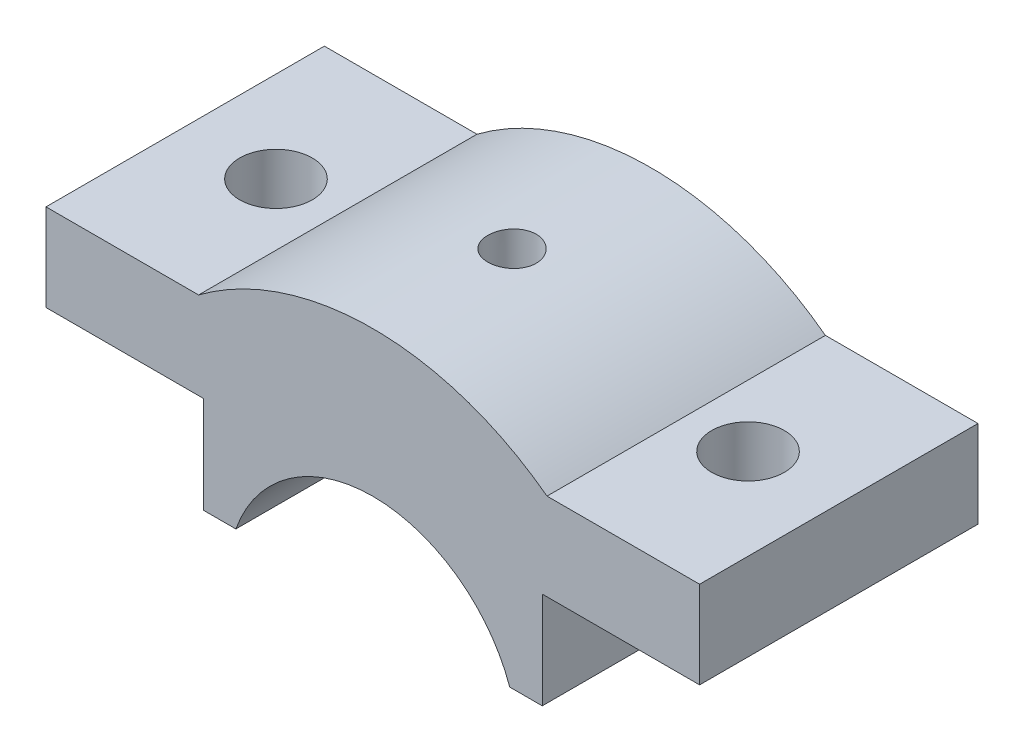
ISO-10303-21;
HEADER;
FILE_DESCRIPTION(('STEP AP214'),'2;1');
FILE_NAME('part.step','',(''),(''),'','','');
FILE_SCHEMA(('AUTOMOTIVE_DESIGN { 1 0 10303 214 1 1 1 1 }'));
ENDSEC;
DATA;
#1=APPLICATION_CONTEXT('core data for automotive mechanical design processes');
#2=APPLICATION_PROTOCOL_DEFINITION('international standard','automotive_design',2000,#1);
#3=PRODUCT_CONTEXT('',#1,'mechanical');
#4=PRODUCT('Part','Part','',(#3));
#5=PRODUCT_RELATED_PRODUCT_CATEGORY('part','',(#4));
#6=PRODUCT_DEFINITION_FORMATION('','',#4);
#7=PRODUCT_DEFINITION_CONTEXT('part definition',#1,'design');
#8=PRODUCT_DEFINITION('design','',#6,#7);
#9=PRODUCT_DEFINITION_SHAPE('','',#8);
#10=(LENGTH_UNIT() NAMED_UNIT(*) SI_UNIT(.MILLI.,.METRE.));
#11=(NAMED_UNIT(*) PLANE_ANGLE_UNIT() SI_UNIT($,.RADIAN.));
#12=(NAMED_UNIT(*) SI_UNIT($,.STERADIAN.) SOLID_ANGLE_UNIT());
#13=UNCERTAINTY_MEASURE_WITH_UNIT(LENGTH_MEASURE(1.E-05),#10,'distance_accuracy_value','');
#14=(GEOMETRIC_REPRESENTATION_CONTEXT(3) GLOBAL_UNCERTAINTY_ASSIGNED_CONTEXT((#13)) GLOBAL_UNIT_ASSIGNED_CONTEXT((#10,
#11,#12)) REPRESENTATION_CONTEXT('',''));
#15=CARTESIAN_POINT('',(0.,0.,0.));
#16=DIRECTION('',(0.,0.,1.));
#17=DIRECTION('',(1.,0.,0.));
#18=AXIS2_PLACEMENT_3D('',#15,#16,#17);
#19=CARTESIAN_POINT('',(0.,0.,23.));
#20=DIRECTION('',(0.,0.,-1.));
#21=DIRECTION('',(-1.,0.,0.));
#22=AXIS2_PLACEMENT_3D('',#19,#20,#21);
#23=CYLINDRICAL_SURFACE('',#22,48.);
#24=CARTESIAN_POINT('',(0.,0.,-23.));
#25=DIRECTION('',(0.,0.,1.));
#26=DIRECTION('',(1.,0.,0.));
#27=AXIS2_PLACEMENT_3D('',#24,#25,#26);
#28=CIRCLE('',#27,48.);
#29=CARTESIAN_POINT('',(28.7858838877286,38.4105830312716,-23.));
#30=VERTEX_POINT('',#29);
#31=CARTESIAN_POINT('',(-28.7858838877286,38.4105830312716,-23.));
#32=VERTEX_POINT('',#31);
#33=EDGE_CURVE('E196',#30,#32,#28,.T.);
#34=ORIENTED_EDGE('',*,*,#33,.T.);
#35=DIRECTION('',(0.,0.,-1.));
#36=VECTOR('',#35,1.);
#37=CARTESIAN_POINT('',(-28.7858838877286,38.4105830312716,23.));
#38=LINE('',#37,#36);
#39=CARTESIAN_POINT('',(-28.7858838877286,38.4105830312716,23.));
#40=VERTEX_POINT('',#39);
#41=EDGE_CURVE('E222',#40,#32,#38,.T.);
#42=ORIENTED_EDGE('',*,*,#41,.F.);
#43=CARTESIAN_POINT('',(0.,0.,23.));
#44=DIRECTION('',(0.,0.,1.));
#45=DIRECTION('',(1.,0.,0.));
#46=AXIS2_PLACEMENT_3D('',#43,#44,#45);
#47=CIRCLE('',#46,48.);
#48=CARTESIAN_POINT('',(28.7858838877286,38.4105830312716,23.));
#49=VERTEX_POINT('',#48);
#50=EDGE_CURVE('E371',#49,#40,#47,.T.);
#51=ORIENTED_EDGE('',*,*,#50,.F.);
#52=DIRECTION('',(0.,0.,-1.));
#53=VECTOR('',#52,1.);
#54=CARTESIAN_POINT('',(28.7858838877286,38.4105830312716,23.));
#55=LINE('',#54,#53);
#56=EDGE_CURVE('E226',#49,#30,#55,.T.);
#57=ORIENTED_EDGE('',*,*,#56,.T.);
#58=EDGE_LOOP('',(#34,#42,#51,#57));
#59=FACE_BOUND('',#58,.T.);
#60=CARTESIAN_POINT('',(0.,48.,-4.));
#61=CARTESIAN_POINT('',(-1.05752799732265,48.,-4.));
#62=CARTESIAN_POINT('',(-2.09108774168189,47.9601222706748,-3.5659117236837));
#63=CARTESIAN_POINT('',(-3.56632336716946,47.8730332630205,-2.09038561162722));
#64=CARTESIAN_POINT('',(-3.99943376542558,47.8330903233125,-1.04611595564905));
#65=CARTESIAN_POINT('',(-4.00056506023606,47.8329957197018,1.04178128007185));
#66=CARTESIAN_POINT('',(-3.57621927763035,47.8724331418488,2.07994955956065));
#67=CARTESIAN_POINT('',(-2.08322792062975,47.9606021717116,3.57431055208135));
#68=CARTESIAN_POINT('',(-1.04582107278193,47.9999683666595,3.9996203998891));
#69=CARTESIAN_POINT('',(1.04291530655166,48.000031589364,4.00037907239353));
#70=CARTESIAN_POINT('',(2.08744657475978,47.9602906118977,3.56798183397225));
#71=CARTESIAN_POINT('',(3.56394710745221,47.873219964772,2.09432771679011));
#72=CARTESIAN_POINT('',(3.99896851203287,47.8331292297215,1.06031077841387));
#73=CARTESIAN_POINT('',(4.00102768852446,47.832957032815,-1.05251391568548));
#74=CARTESIAN_POINT('',(3.56801605424093,47.8729030471747,-2.08766850917427));
#75=CARTESIAN_POINT('',(2.09331291409821,47.960021119378,-3.56470747904911));
#76=CARTESIAN_POINT('',(1.05752799732265,48.,-4.));
#77=CARTESIAN_POINT('',(0.,48.,-4.));
#78=B_SPLINE_CURVE_WITH_KNOTS('',3,(#60,#61,#62,#63,#64,#65,#66,#67,#68,#69,#70,#71,#72,#73,#74,
#75,#76,#77),.UNSPECIFIED.,.T.,.F.,(4,2,2,2,2,2,2,2,4),(0.,0.125,0.25,0.375,0.5,0.625,0.75,
0.875,1.),.UNSPECIFIED.);
#79=CARTESIAN_POINT('',(0.,48.,-4.));
#80=VERTEX_POINT('',#79);
#81=EDGE_CURVE('E252',#80,#80,#78,.T.);
#82=ORIENTED_EDGE('',*,*,#81,.F.);
#83=EDGE_LOOP('',(#82));
#84=FACE_BOUND('',#83,.T.);
#85=ADVANCED_FACE('F45',(#59,#84),#23,.T.);
#86=CARTESIAN_POINT('',(0.,0.,23.));
#87=DIRECTION('',(0.,0.,-1.));
#88=DIRECTION('',(-1.,0.,0.));
#89=AXIS2_PLACEMENT_3D('',#86,#87,#88);
#90=CYLINDRICAL_SURFACE('',#89,24.);
#91=CARTESIAN_POINT('',(0.,0.,-23.));
#92=DIRECTION('',(0.,0.,-1.));
#93=DIRECTION('',(1.,0.,0.));
#94=AXIS2_PLACEMENT_3D('',#91,#92,#93);
#95=CIRCLE('',#94,24.);
#96=CARTESIAN_POINT('',(-22.6274169979695,8.,-23.));
#97=VERTEX_POINT('',#96);
#98=CARTESIAN_POINT('',(22.6274169979695,7.99999999999999,-23.));
#99=VERTEX_POINT('',#98);
#100=EDGE_CURVE('E176',#97,#99,#95,.T.);
#101=ORIENTED_EDGE('',*,*,#100,.T.);
#102=DIRECTION('',(0.,0.,-1.));
#103=VECTOR('',#102,1.);
#104=CARTESIAN_POINT('',(22.6274169979695,7.99999999999999,23.));
#105=LINE('',#104,#103);
#106=CARTESIAN_POINT('',(22.6274169979695,7.99999999999999,23.));
#107=VERTEX_POINT('',#106);
#108=EDGE_CURVE('E11',#107,#99,#105,.T.);
#109=ORIENTED_EDGE('',*,*,#108,.F.);
#110=CARTESIAN_POINT('',(0.,0.,23.));
#111=DIRECTION('',(0.,0.,-1.));
#112=DIRECTION('',(1.,0.,0.));
#113=AXIS2_PLACEMENT_3D('',#110,#111,#112);
#114=CIRCLE('',#113,24.);
#115=CARTESIAN_POINT('',(-22.6274169979695,8.,23.));
#116=VERTEX_POINT('',#115);
#117=EDGE_CURVE('E211',#116,#107,#114,.T.);
#118=ORIENTED_EDGE('',*,*,#117,.F.);
#119=DIRECTION('',(0.,0.,-1.));
#120=VECTOR('',#119,1.);
#121=CARTESIAN_POINT('',(-22.6274169979695,8.,23.));
#122=LINE('',#121,#120);
#123=EDGE_CURVE('E172',#116,#97,#122,.T.);
#124=ORIENTED_EDGE('',*,*,#123,.T.);
#125=EDGE_LOOP('',(#101,#109,#118,#124));
#126=FACE_BOUND('',#125,.T.);
#127=ADVANCED_FACE('F47',(#126),#90,.F.);
#128=CARTESIAN_POINT('',(22.6274169979695,7.99999999999999,23.));
#129=DIRECTION('',(0.,1.,0.));
#130=DIRECTION('',(-1.,0.,0.));
#131=AXIS2_PLACEMENT_3D('',#128,#129,#130);
#132=PLANE('',#131);
#133=DIRECTION('',(1.,0.,0.));
#134=VECTOR('',#133,1.);
#135=CARTESIAN_POINT('',(22.6274169979695,7.99999999999999,-23.));
#136=LINE('',#135,#134);
#137=CARTESIAN_POINT('',(28.,8.,-23.));
#138=VERTEX_POINT('',#137);
#139=EDGE_CURVE('E180',#99,#138,#136,.T.);
#140=ORIENTED_EDGE('',*,*,#139,.T.);
#141=DIRECTION('',(0.,0.,-1.));
#142=VECTOR('',#141,1.);
#143=CARTESIAN_POINT('',(28.,8.,23.));
#144=LINE('',#143,#142);
#145=CARTESIAN_POINT('',(28.,8.,23.));
#146=VERTEX_POINT('',#145);
#147=EDGE_CURVE('E58',#146,#138,#144,.T.);
#148=ORIENTED_EDGE('',*,*,#147,.F.);
#149=DIRECTION('',(1.,0.,0.));
#150=VECTOR('',#149,1.);
#151=CARTESIAN_POINT('',(22.6274169979695,7.99999999999999,23.));
#152=LINE('',#151,#150);
#153=EDGE_CURVE('E122',#107,#146,#152,.T.);
#154=ORIENTED_EDGE('',*,*,#153,.F.);
#155=ORIENTED_EDGE('',*,*,#108,.T.);
#156=EDGE_LOOP('',(#140,#148,#154,#155));
#157=FACE_BOUND('',#156,.T.);
#158=ADVANCED_FACE('F341',(#157),#132,.F.);
#159=CARTESIAN_POINT('',(28.,8.,23.));
#160=DIRECTION('',(-1.,0.,0.));
#161=DIRECTION('',(0.,0.,1.));
#162=AXIS2_PLACEMENT_3D('',#159,#160,#161);
#163=PLANE('',#162);
#164=DIRECTION('',(0.,1.,0.));
#165=VECTOR('',#164,1.);
#166=CARTESIAN_POINT('',(28.,8.,-23.));
#167=LINE('',#166,#165);
#168=CARTESIAN_POINT('',(28.,24.,-23.));
#169=VERTEX_POINT('',#168);
#170=EDGE_CURVE('E184',#138,#169,#167,.T.);
#171=ORIENTED_EDGE('',*,*,#170,.T.);
#172=DIRECTION('',(0.,0.,-1.));
#173=VECTOR('',#172,1.);
#174=CARTESIAN_POINT('',(28.,24.,23.));
#175=LINE('',#174,#173);
#176=CARTESIAN_POINT('',(28.,24.,23.));
#177=VERTEX_POINT('',#176);
#178=EDGE_CURVE('E238',#177,#169,#175,.T.);
#179=ORIENTED_EDGE('',*,*,#178,.F.);
#180=DIRECTION('',(0.,1.,0.));
#181=VECTOR('',#180,1.);
#182=CARTESIAN_POINT('',(28.,8.,23.));
#183=LINE('',#182,#181);
#184=EDGE_CURVE('E353',#146,#177,#183,.T.);
#185=ORIENTED_EDGE('',*,*,#184,.F.);
#186=ORIENTED_EDGE('',*,*,#147,.T.);
#187=EDGE_LOOP('',(#171,#179,#185,#186));
#188=FACE_BOUND('',#187,.T.);
#189=ADVANCED_FACE('F338',(#188),#163,.F.);
#190=CARTESIAN_POINT('',(28.,24.,23.));
#191=DIRECTION('',(0.,1.,0.));
#192=DIRECTION('',(-1.,0.,0.));
#193=AXIS2_PLACEMENT_3D('',#190,#191,#192);
#194=PLANE('',#193);
#195=CARTESIAN_POINT('',(39.,24.,0.));
#196=DIRECTION('',(0.,1.,0.));
#197=DIRECTION('',(-1.,0.,0.));
#198=AXIS2_PLACEMENT_3D('',#195,#196,#197);
#199=CIRCLE('',#198,5.99999999999999);
#200=CARTESIAN_POINT('',(33.,24.,0.));
#201=VERTEX_POINT('',#200);
#202=EDGE_CURVE('E181',#201,#201,#199,.T.);
#203=ORIENTED_EDGE('',*,*,#202,.T.);
#204=EDGE_LOOP('',(#203));
#205=FACE_BOUND('',#204,.T.);
#206=DIRECTION('',(1.,0.,0.));
#207=VECTOR('',#206,1.);
#208=CARTESIAN_POINT('',(28.,24.,-23.));
#209=LINE('',#208,#207);
#210=CARTESIAN_POINT('',(54.,24.,-23.));
#211=VERTEX_POINT('',#210);
#212=EDGE_CURVE('E187',#169,#211,#209,.T.);
#213=ORIENTED_EDGE('',*,*,#212,.T.);
#214=DIRECTION('',(0.,0.,-1.));
#215=VECTOR('',#214,1.);
#216=CARTESIAN_POINT('',(54.,24.,23.));
#217=LINE('',#216,#215);
#218=CARTESIAN_POINT('',(54.,24.,23.));
#219=VERTEX_POINT('',#218);
#220=EDGE_CURVE('E234',#219,#211,#217,.T.);
#221=ORIENTED_EDGE('',*,*,#220,.F.);
#222=DIRECTION('',(1.,0.,0.));
#223=VECTOR('',#222,1.);
#224=CARTESIAN_POINT('',(28.,24.,23.));
#225=LINE('',#224,#223);
#226=EDGE_CURVE('E366',#177,#219,#225,.T.);
#227=ORIENTED_EDGE('',*,*,#226,.F.);
#228=ORIENTED_EDGE('',*,*,#178,.T.);
#229=EDGE_LOOP('',(#213,#221,#227,#228));
#230=FACE_BOUND('',#229,.T.);
#231=ADVANCED_FACE('F334',(#205,#230),#194,.F.);
#232=CARTESIAN_POINT('',(54.,24.,23.));
#233=DIRECTION('',(-1.,0.,0.));
#234=DIRECTION('',(0.,-1.,0.));
#235=AXIS2_PLACEMENT_3D('',#232,#233,#234);
#236=PLANE('',#235);
#237=DIRECTION('',(0.,1.,0.));
#238=VECTOR('',#237,1.);
#239=CARTESIAN_POINT('',(54.,24.,-23.));
#240=LINE('',#239,#238);
#241=CARTESIAN_POINT('',(54.,38.4105830312716,-23.));
#242=VERTEX_POINT('',#241);
#243=EDGE_CURVE('E190',#211,#242,#240,.T.);
#244=ORIENTED_EDGE('',*,*,#243,.T.);
#245=DIRECTION('',(0.,0.,-1.));
#246=VECTOR('',#245,1.);
#247=CARTESIAN_POINT('',(54.,38.4105830312716,23.));
#248=LINE('',#247,#246);
#249=CARTESIAN_POINT('',(54.,38.4105830312716,23.));
#250=VERTEX_POINT('',#249);
#251=EDGE_CURVE('E230',#250,#242,#248,.T.);
#252=ORIENTED_EDGE('',*,*,#251,.F.);
#253=DIRECTION('',(0.,1.,0.));
#254=VECTOR('',#253,1.);
#255=CARTESIAN_POINT('',(54.,24.,23.));
#256=LINE('',#255,#254);
#257=EDGE_CURVE('E362',#219,#250,#256,.T.);
#258=ORIENTED_EDGE('',*,*,#257,.F.);
#259=ORIENTED_EDGE('',*,*,#220,.T.);
#260=EDGE_LOOP('',(#244,#252,#258,#259));
#261=FACE_BOUND('',#260,.T.);
#262=ADVANCED_FACE('F330',(#261),#236,.F.);
#263=CARTESIAN_POINT('',(54.,38.4105830312716,23.));
#264=DIRECTION('',(0.,-1.,0.));
#265=DIRECTION('',(0.,0.,-1.));
#266=AXIS2_PLACEMENT_3D('',#263,#264,#265);
#267=PLANE('',#266);
#268=CARTESIAN_POINT('',(39.,38.4105830312716,0.));
#269=DIRECTION('',(0.,1.,0.));
#270=DIRECTION('',(0.,0.,1.));
#271=AXIS2_PLACEMENT_3D('',#268,#269,#270);
#272=CIRCLE('',#271,5.99999999999999);
#273=CARTESIAN_POINT('',(39.,38.4105830312716,5.99999999999999));
#274=VERTEX_POINT('',#273);
#275=EDGE_CURVE('E256',#274,#274,#272,.T.);
#276=ORIENTED_EDGE('',*,*,#275,.F.);
#277=EDGE_LOOP('',(#276));
#278=FACE_BOUND('',#277,.T.);
#279=DIRECTION('',(-1.,0.,0.));
#280=VECTOR('',#279,1.);
#281=CARTESIAN_POINT('',(54.,38.4105830312716,-23.));
#282=LINE('',#281,#280);
#283=EDGE_CURVE('E193',#242,#30,#282,.T.);
#284=ORIENTED_EDGE('',*,*,#283,.T.);
#285=ORIENTED_EDGE('',*,*,#56,.F.);
#286=DIRECTION('',(-1.,0.,0.));
#287=VECTOR('',#286,1.);
#288=CARTESIAN_POINT('',(54.,38.4105830312716,23.));
#289=LINE('',#288,#287);
#290=EDGE_CURVE('E365',#250,#49,#289,.T.);
#291=ORIENTED_EDGE('',*,*,#290,.F.);
#292=ORIENTED_EDGE('',*,*,#251,.T.);
#293=EDGE_LOOP('',(#284,#285,#291,#292));
#294=FACE_BOUND('',#293,.T.);
#295=ADVANCED_FACE('F322',(#278,#294),#267,.F.);
#296=CARTESIAN_POINT('',(-54.,38.4105830312716,23.));
#297=DIRECTION('',(0.,-1.,0.));
#298=DIRECTION('',(0.,0.,-1.));
#299=AXIS2_PLACEMENT_3D('',#296,#297,#298);
#300=PLANE('',#299);
#301=CARTESIAN_POINT('',(-39.,38.4105830312716,0.));
#302=DIRECTION('',(0.,1.,0.));
#303=DIRECTION('',(0.,0.,1.));
#304=AXIS2_PLACEMENT_3D('',#301,#302,#303);
#305=CIRCLE('',#304,5.99999999999999);
#306=CARTESIAN_POINT('',(-39.,38.4105830312716,5.99999999999999));
#307=VERTEX_POINT('',#306);
#308=EDGE_CURVE('E248',#307,#307,#305,.F.);
#309=ORIENTED_EDGE('',*,*,#308,.T.);
#310=EDGE_LOOP('',(#309));
#311=FACE_BOUND('',#310,.T.);
#312=DIRECTION('',(-1.,0.,0.));
#313=VECTOR('',#312,1.);
#314=CARTESIAN_POINT('',(-54.,38.4105830312716,-23.));
#315=LINE('',#314,#313);
#316=CARTESIAN_POINT('',(-54.,38.4105830312716,-23.));
#317=VERTEX_POINT('',#316);
#318=EDGE_CURVE('E199',#32,#317,#315,.T.);
#319=ORIENTED_EDGE('',*,*,#318,.T.);
#320=DIRECTION('',(0.,0.,-1.));
#321=VECTOR('',#320,1.);
#322=CARTESIAN_POINT('',(-54.,38.4105830312716,23.));
#323=LINE('',#322,#321);
#324=CARTESIAN_POINT('',(-54.,38.4105830312716,23.));
#325=VERTEX_POINT('',#324);
#326=EDGE_CURVE('E218',#325,#317,#323,.T.);
#327=ORIENTED_EDGE('',*,*,#326,.F.);
#328=DIRECTION('',(-1.,0.,0.));
#329=VECTOR('',#328,1.);
#330=CARTESIAN_POINT('',(-54.,38.4105830312716,23.));
#331=LINE('',#330,#329);
#332=EDGE_CURVE('E378',#40,#325,#331,.T.);
#333=ORIENTED_EDGE('',*,*,#332,.F.);
#334=ORIENTED_EDGE('',*,*,#41,.T.);
#335=EDGE_LOOP('',(#319,#327,#333,#334));
#336=FACE_BOUND('',#335,.T.);
#337=ADVANCED_FACE('F319',(#311,#336),#300,.F.);
#338=CARTESIAN_POINT('',(-54.,24.,23.));
#339=DIRECTION('',(1.,0.,0.));
#340=DIRECTION('',(0.,1.,0.));
#341=AXIS2_PLACEMENT_3D('',#338,#339,#340);
#342=PLANE('',#341);
#343=DIRECTION('',(0.,-1.,0.));
#344=VECTOR('',#343,1.);
#345=CARTESIAN_POINT('',(-54.,24.,-23.));
#346=LINE('',#345,#344);
#347=CARTESIAN_POINT('',(-54.,24.,-23.));
#348=VERTEX_POINT('',#347);
#349=EDGE_CURVE('E202',#317,#348,#346,.T.);
#350=ORIENTED_EDGE('',*,*,#349,.T.);
#351=DIRECTION('',(0.,0.,-1.));
#352=VECTOR('',#351,1.);
#353=CARTESIAN_POINT('',(-54.,24.,23.));
#354=LINE('',#353,#352);
#355=CARTESIAN_POINT('',(-54.,24.,23.));
#356=VERTEX_POINT('',#355);
#357=EDGE_CURVE('E164',#356,#348,#354,.T.);
#358=ORIENTED_EDGE('',*,*,#357,.F.);
#359=DIRECTION('',(0.,-1.,0.));
#360=VECTOR('',#359,1.);
#361=CARTESIAN_POINT('',(-54.,24.,23.));
#362=LINE('',#361,#360);
#363=EDGE_CURVE('E153',#325,#356,#362,.T.);
#364=ORIENTED_EDGE('',*,*,#363,.F.);
#365=ORIENTED_EDGE('',*,*,#326,.T.);
#366=EDGE_LOOP('',(#350,#358,#364,#365));
#367=FACE_BOUND('',#366,.T.);
#368=ADVANCED_FACE('F315',(#367),#342,.F.);
#369=CARTESIAN_POINT('',(-28.,24.,23.));
#370=DIRECTION('',(0.,1.,0.));
#371=DIRECTION('',(-1.,0.,0.));
#372=AXIS2_PLACEMENT_3D('',#369,#370,#371);
#373=PLANE('',#372);
#374=CARTESIAN_POINT('',(-39.,24.,0.));
#375=DIRECTION('',(0.,1.,0.));
#376=DIRECTION('',(-1.,0.,0.));
#377=AXIS2_PLACEMENT_3D('',#374,#375,#376);
#378=CIRCLE('',#377,5.99999999999999);
#379=CARTESIAN_POINT('',(-45.,24.,0.));
#380=VERTEX_POINT('',#379);
#381=EDGE_CURVE('E245',#380,#380,#378,.F.);
#382=ORIENTED_EDGE('',*,*,#381,.F.);
#383=EDGE_LOOP('',(#382));
#384=FACE_BOUND('',#383,.T.);
#385=DIRECTION('',(1.,0.,0.));
#386=VECTOR('',#385,1.);
#387=CARTESIAN_POINT('',(-28.,24.,-23.));
#388=LINE('',#387,#386);
#389=CARTESIAN_POINT('',(-28.,24.,-23.));
#390=VERTEX_POINT('',#389);
#391=EDGE_CURVE('E162',#348,#390,#388,.T.);
#392=ORIENTED_EDGE('',*,*,#391,.T.);
#393=DIRECTION('',(0.,0.,-1.));
#394=VECTOR('',#393,1.);
#395=CARTESIAN_POINT('',(-28.,24.,23.));
#396=LINE('',#395,#394);
#397=CARTESIAN_POINT('',(-28.,24.,23.));
#398=VERTEX_POINT('',#397);
#399=EDGE_CURVE('E159',#398,#390,#396,.T.);
#400=ORIENTED_EDGE('',*,*,#399,.F.);
#401=DIRECTION('',(1.,0.,0.));
#402=VECTOR('',#401,1.);
#403=CARTESIAN_POINT('',(-28.,24.,23.));
#404=LINE('',#403,#402);
#405=EDGE_CURVE('E147',#356,#398,#404,.T.);
#406=ORIENTED_EDGE('',*,*,#405,.F.);
#407=ORIENTED_EDGE('',*,*,#357,.T.);
#408=EDGE_LOOP('',(#392,#400,#406,#407));
#409=FACE_BOUND('',#408,.T.);
#410=ADVANCED_FACE('F160',(#384,#409),#373,.F.);
#411=CARTESIAN_POINT('',(-28.,8.,23.));
#412=DIRECTION('',(1.,0.,0.));
#413=DIRECTION('',(0.,0.,-1.));
#414=AXIS2_PLACEMENT_3D('',#411,#412,#413);
#415=PLANE('',#414);
#416=DIRECTION('',(0.,-1.,0.));
#417=VECTOR('',#416,1.);
#418=CARTESIAN_POINT('',(-28.,8.,-23.));
#419=LINE('',#418,#417);
#420=CARTESIAN_POINT('',(-28.,8.,-23.));
#421=VERTEX_POINT('',#420);
#422=EDGE_CURVE('E108',#390,#421,#419,.T.);
#423=ORIENTED_EDGE('',*,*,#422,.T.);
#424=DIRECTION('',(0.,0.,-1.));
#425=VECTOR('',#424,1.);
#426=CARTESIAN_POINT('',(-28.,8.,23.));
#427=LINE('',#426,#425);
#428=CARTESIAN_POINT('',(-28.,8.,23.));
#429=VERTEX_POINT('',#428);
#430=EDGE_CURVE('E165',#429,#421,#427,.T.);
#431=ORIENTED_EDGE('',*,*,#430,.F.);
#432=DIRECTION('',(0.,-1.,0.));
#433=VECTOR('',#432,1.);
#434=CARTESIAN_POINT('',(-28.,8.,23.));
#435=LINE('',#434,#433);
#436=EDGE_CURVE('E151',#398,#429,#435,.T.);
#437=ORIENTED_EDGE('',*,*,#436,.F.);
#438=ORIENTED_EDGE('',*,*,#399,.T.);
#439=EDGE_LOOP('',(#423,#431,#437,#438));
#440=FACE_BOUND('',#439,.T.);
#441=ADVANCED_FACE('F167',(#440),#415,.F.);
#442=CARTESIAN_POINT('',(-22.6274169979695,8.,23.));
#443=DIRECTION('',(0.,1.,0.));
#444=DIRECTION('',(0.,0.,1.));
#445=AXIS2_PLACEMENT_3D('',#442,#443,#444);
#446=PLANE('',#445);
#447=DIRECTION('',(1.,0.,0.));
#448=VECTOR('',#447,1.);
#449=CARTESIAN_POINT('',(-22.6274169979695,8.,-23.));
#450=LINE('',#449,#448);
#451=EDGE_CURVE('E114',#421,#97,#450,.T.);
#452=ORIENTED_EDGE('',*,*,#451,.T.);
#453=ORIENTED_EDGE('',*,*,#123,.F.);
#454=DIRECTION('',(1.,0.,0.));
#455=VECTOR('',#454,1.);
#456=CARTESIAN_POINT('',(-22.6274169979695,8.,23.));
#457=LINE('',#456,#455);
#458=EDGE_CURVE('E67',#429,#116,#457,.T.);
#459=ORIENTED_EDGE('',*,*,#458,.F.);
#460=ORIENTED_EDGE('',*,*,#430,.T.);
#461=EDGE_LOOP('',(#452,#453,#459,#460));
#462=FACE_BOUND('',#461,.T.);
#463=ADVANCED_FACE('F305',(#462),#446,.F.);
#464=CARTESIAN_POINT('',(0.,0.,23.));
#465=DIRECTION('',(0.,0.,1.));
#466=DIRECTION('',(1.,0.,0.));
#467=AXIS2_PLACEMENT_3D('',#464,#465,#466);
#468=PLANE('',#467);
#469=ORIENTED_EDGE('',*,*,#117,.T.);
#470=ORIENTED_EDGE('',*,*,#153,.T.);
#471=ORIENTED_EDGE('',*,*,#184,.T.);
#472=ORIENTED_EDGE('',*,*,#226,.T.);
#473=ORIENTED_EDGE('',*,*,#257,.T.);
#474=ORIENTED_EDGE('',*,*,#290,.T.);
#475=ORIENTED_EDGE('',*,*,#50,.T.);
#476=ORIENTED_EDGE('',*,*,#332,.T.);
#477=ORIENTED_EDGE('',*,*,#363,.T.);
#478=ORIENTED_EDGE('',*,*,#405,.T.);
#479=ORIENTED_EDGE('',*,*,#436,.T.);
#480=ORIENTED_EDGE('',*,*,#458,.T.);
#481=EDGE_LOOP('',(#469,#470,#471,#472,#473,#474,#475,#476,#477,#478,#479,#480));
#482=FACE_BOUND('',#481,.T.);
#483=ADVANCED_FACE('F149',(#482),#468,.T.);
#484=CARTESIAN_POINT('',(0.,0.,-23.));
#485=DIRECTION('',(0.,0.,1.));
#486=DIRECTION('',(1.,0.,0.));
#487=AXIS2_PLACEMENT_3D('',#484,#485,#486);
#488=PLANE('',#487);
#489=ORIENTED_EDGE('',*,*,#100,.F.);
#490=ORIENTED_EDGE('',*,*,#451,.F.);
#491=ORIENTED_EDGE('',*,*,#422,.F.);
#492=ORIENTED_EDGE('',*,*,#391,.F.);
#493=ORIENTED_EDGE('',*,*,#349,.F.);
#494=ORIENTED_EDGE('',*,*,#318,.F.);
#495=ORIENTED_EDGE('',*,*,#33,.F.);
#496=ORIENTED_EDGE('',*,*,#283,.F.);
#497=ORIENTED_EDGE('',*,*,#243,.F.);
#498=ORIENTED_EDGE('',*,*,#212,.F.);
#499=ORIENTED_EDGE('',*,*,#170,.F.);
#500=ORIENTED_EDGE('',*,*,#139,.F.);
#501=EDGE_LOOP('',(#489,#490,#491,#492,#493,#494,#495,#496,#497,#498,#499,#500));
#502=FACE_BOUND('',#501,.T.);
#503=ADVANCED_FACE('F298',(#502),#488,.F.);
#504=CARTESIAN_POINT('',(-39.,7.99999999999999,0.));
#505=DIRECTION('',(0.,1.,0.));
#506=DIRECTION('',(0.,0.,1.));
#507=AXIS2_PLACEMENT_3D('',#504,#505,#506);
#508=CYLINDRICAL_SURFACE('',#507,5.99999999999999);
#509=ORIENTED_EDGE('',*,*,#308,.F.);
#510=EDGE_LOOP('',(#509));
#511=FACE_BOUND('',#510,.T.);
#512=ORIENTED_EDGE('',*,*,#381,.T.);
#513=EDGE_LOOP('',(#512));
#514=FACE_BOUND('',#513,.T.);
#515=ADVANCED_FACE('F295',(#511,#514),#508,.F.);
#516=CARTESIAN_POINT('',(39.,7.99999999999999,0.));
#517=DIRECTION('',(0.,1.,0.));
#518=DIRECTION('',(0.,0.,1.));
#519=AXIS2_PLACEMENT_3D('',#516,#517,#518);
#520=CYLINDRICAL_SURFACE('',#519,5.99999999999999);
#521=ORIENTED_EDGE('',*,*,#275,.T.);
#522=EDGE_LOOP('',(#521));
#523=FACE_BOUND('',#522,.T.);
#524=ORIENTED_EDGE('',*,*,#202,.F.);
#525=EDGE_LOOP('',(#524));
#526=FACE_BOUND('',#525,.T.);
#527=ADVANCED_FACE('F292',(#523,#526),#520,.F.);
#528=CARTESIAN_POINT('',(0.,-18.,23.));
#529=DIRECTION('',(0.,0.,-1.));
#530=DIRECTION('',(-1.,0.,0.));
#531=AXIS2_PLACEMENT_3D('',#528,#529,#530);
#532=CYLINDRICAL_SURFACE('',#531,48.);
#533=CARTESIAN_POINT('',(0.,30.,-4.));
#534=CARTESIAN_POINT('',(1.05752799732265,30.0000000000001,-4.));
#535=CARTESIAN_POINT('',(2.09331291409821,29.960021119378,-3.56470747904911));
#536=CARTESIAN_POINT('',(3.56801605424093,29.8729030471748,-2.08766850917427));
#537=CARTESIAN_POINT('',(4.00102768852446,29.832957032815,-1.05251391568548));
#538=CARTESIAN_POINT('',(3.99896851203287,29.8331292297215,1.06031077841387));
#539=CARTESIAN_POINT('',(3.56394710745221,29.873219964772,2.09432771679011));
#540=CARTESIAN_POINT('',(2.08744657475978,29.9602906118977,3.56798183397225));
#541=CARTESIAN_POINT('',(1.04291530655166,30.0000315893641,4.00037907239353));
#542=CARTESIAN_POINT('',(-1.04582107278193,29.9999683666596,3.9996203998891));
#543=CARTESIAN_POINT('',(-2.08322792062975,29.9606021717116,3.57431055208135));
#544=CARTESIAN_POINT('',(-3.57621927763035,29.8724331418488,2.07994955956065));
#545=CARTESIAN_POINT('',(-4.00056506023606,29.8329957197018,1.04178128007185));
#546=CARTESIAN_POINT('',(-3.99943376542558,29.8330903233125,-1.04611595564905));
#547=CARTESIAN_POINT('',(-3.56632336716946,29.8730332630205,-2.09038561162722));
#548=CARTESIAN_POINT('',(-2.09108774168189,29.9601222706748,-3.5659117236837));
#549=CARTESIAN_POINT('',(-1.05752799732265,30.,-4.));
#550=CARTESIAN_POINT('',(0.,30.,-4.));
#551=B_SPLINE_CURVE_WITH_KNOTS('',3,(#533,#534,#535,#536,#537,#538,#539,#540,#541,#542,#543,
#544,#545,#546,#547,#548,#549,#550),.UNSPECIFIED.,.T.,.F.,(4,2,2,2,2,2,2,2,4),(0.,0.125,0.25,
0.375,0.5,0.625,0.75,0.875,1.),.UNSPECIFIED.);
#552=CARTESIAN_POINT('',(0.,30.,-4.));
#553=VERTEX_POINT('',#552);
#554=EDGE_CURVE('E257',#553,#553,#551,.F.);
#555=ORIENTED_EDGE('',*,*,#554,.T.);
#556=EDGE_LOOP('',(#555));
#557=FACE_BOUND('',#556,.T.);
#558=ADVANCED_FACE('F268',(#557),#532,.T.);
#559=CARTESIAN_POINT('',(0.,48.,-4.));
#560=CARTESIAN_POINT('',(-1.05752799732265,48.,-4.));
#561=CARTESIAN_POINT('',(-2.09108774168189,47.9601222706748,-3.5659117236837));
#562=CARTESIAN_POINT('',(-3.56632336716946,47.8730332630205,-2.09038561162722));
#563=CARTESIAN_POINT('',(-3.99943376542558,47.8330903233125,-1.04611595564905));
#564=CARTESIAN_POINT('',(-4.00056506023606,47.8329957197018,1.04178128007185));
#565=CARTESIAN_POINT('',(-3.57621927763035,47.8724331418488,2.07994955956065));
#566=CARTESIAN_POINT('',(-2.08322792062975,47.9606021717116,3.57431055208135));
#567=CARTESIAN_POINT('',(-1.04582107278193,47.9999683666595,3.9996203998891));
#568=CARTESIAN_POINT('',(1.04291530655166,48.000031589364,4.00037907239353));
#569=CARTESIAN_POINT('',(2.08744657475978,47.9602906118977,3.56798183397225));
#570=CARTESIAN_POINT('',(3.56394710745221,47.873219964772,2.09432771679011));
#571=CARTESIAN_POINT('',(3.99896851203287,47.8331292297215,1.06031077841387));
#572=CARTESIAN_POINT('',(4.00102768852446,47.832957032815,-1.05251391568548));
#573=CARTESIAN_POINT('',(3.56801605424093,47.8729030471747,-2.08766850917427));
#574=CARTESIAN_POINT('',(2.09331291409821,47.960021119378,-3.56470747904911));
#575=CARTESIAN_POINT('',(1.05752799732265,48.,-4.));
#576=CARTESIAN_POINT('',(0.,48.,-4.));
#577=B_SPLINE_CURVE_WITH_KNOTS('',3,(#559,#560,#561,#562,#563,#564,#565,#566,#567,#568,#569,
#570,#571,#572,#573,#574,#575,#576),.UNSPECIFIED.,.T.,.F.,(4,2,2,2,2,2,2,2,4),(0.,0.125,0.25,
0.375,0.5,0.625,0.75,0.875,1.),.UNSPECIFIED.);
#578=DIRECTION('',(0.,-1.,0.));
#579=VECTOR('',#578,1.);
#580=SURFACE_OF_LINEAR_EXTRUSION('',#577,#579);
#581=ORIENTED_EDGE('',*,*,#554,.F.);
#582=EDGE_LOOP('',(#581));
#583=FACE_BOUND('',#582,.T.);
#584=ORIENTED_EDGE('',*,*,#81,.T.);
#585=EDGE_LOOP('',(#584));
#586=FACE_BOUND('',#585,.T.);
#587=ADVANCED_FACE('F291',(#583,#586),#580,.T.);
#588=CLOSED_SHELL('',(#85,#127,#158,#189,#231,#262,#295,#337,#368,#410,#441,#463,#483,#503,#515,
#527,#558,#587));
#589=MANIFOLD_SOLID_BREP('B2',#588);
#590=ADVANCED_BREP_SHAPE_REPRESENTATION('',(#18,#589),#14);
#591=SHAPE_DEFINITION_REPRESENTATION(#9,#590);
ENDSEC;
END-ISO-10303-21;
